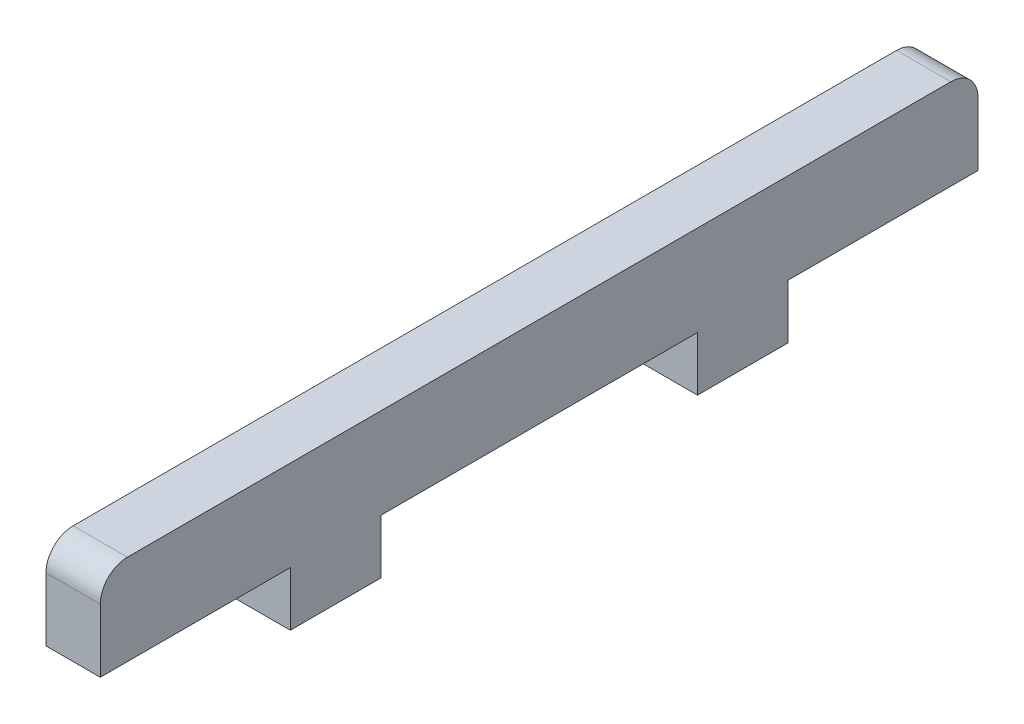
ISO-10303-21;
HEADER;
FILE_DESCRIPTION(('STEP AP214'),'2;1');
FILE_NAME('part.step','',(''),(''),'','','');
FILE_SCHEMA(('AUTOMOTIVE_DESIGN { 1 0 10303 214 1 1 1 1 }'));
ENDSEC;
DATA;
#1=APPLICATION_CONTEXT('core data for automotive mechanical design processes');
#2=APPLICATION_PROTOCOL_DEFINITION('international standard','automotive_design',2000,#1);
#3=PRODUCT_CONTEXT('',#1,'mechanical');
#4=PRODUCT('Part','Part','',(#3));
#5=PRODUCT_RELATED_PRODUCT_CATEGORY('part','',(#4));
#6=PRODUCT_DEFINITION_FORMATION('','',#4);
#7=PRODUCT_DEFINITION_CONTEXT('part definition',#1,'design');
#8=PRODUCT_DEFINITION('design','',#6,#7);
#9=PRODUCT_DEFINITION_SHAPE('','',#8);
#10=(LENGTH_UNIT() NAMED_UNIT(*) SI_UNIT(.MILLI.,.METRE.));
#11=(NAMED_UNIT(*) PLANE_ANGLE_UNIT() SI_UNIT($,.RADIAN.));
#12=(NAMED_UNIT(*) SI_UNIT($,.STERADIAN.) SOLID_ANGLE_UNIT());
#13=UNCERTAINTY_MEASURE_WITH_UNIT(LENGTH_MEASURE(1.E-05),#10,'distance_accuracy_value','');
#14=(GEOMETRIC_REPRESENTATION_CONTEXT(3) GLOBAL_UNCERTAINTY_ASSIGNED_CONTEXT((#13)) GLOBAL_UNIT_ASSIGNED_CONTEXT((#10,
#11,#12)) REPRESENTATION_CONTEXT('',''));
#15=CARTESIAN_POINT('',(0.,0.,0.));
#16=DIRECTION('',(0.,0.,1.));
#17=DIRECTION('',(1.,0.,0.));
#18=AXIS2_PLACEMENT_3D('',#15,#16,#17);
#19=CARTESIAN_POINT('',(6.,243.904678423264,390.651166817679));
#20=DIRECTION('',(0.,0.,-1.));
#21=DIRECTION('',(-1.,0.,0.));
#22=AXIS2_PLACEMENT_3D('',#19,#20,#21);
#23=PLANE('',#22);
#24=DIRECTION('',(0.,-1.,0.));
#25=VECTOR('',#24,1.);
#26=CARTESIAN_POINT('',(6.,243.904678423264,390.651166817679));
#27=LINE('',#26,#25);
#28=CARTESIAN_POINT('',(6.,240.904678423264,390.651166817679));
#29=VERTEX_POINT('',#28);
#30=CARTESIAN_POINT('',(6.,233.904678423264,390.651166817679));
#31=VERTEX_POINT('',#30);
#32=EDGE_CURVE('E133',#29,#31,#27,.T.);
#33=ORIENTED_EDGE('',*,*,#32,.F.);
#34=DIRECTION('',(-1.,0.,0.));
#35=VECTOR('',#34,1.);
#36=CARTESIAN_POINT('',(6.,240.904678423264,390.651166817679));
#37=LINE('',#36,#35);
#38=CARTESIAN_POINT('',(0.,240.904678423264,390.651166817679));
#39=VERTEX_POINT('',#38);
#40=EDGE_CURVE('E11',#29,#39,#37,.T.);
#41=ORIENTED_EDGE('',*,*,#40,.T.);
#42=DIRECTION('',(0.,-1.,0.));
#43=VECTOR('',#42,1.);
#44=CARTESIAN_POINT('',(0.,243.904678423264,390.651166817679));
#45=LINE('',#44,#43);
#46=CARTESIAN_POINT('',(0.,233.904678423264,390.651166817679));
#47=VERTEX_POINT('',#46);
#48=EDGE_CURVE('E153',#39,#47,#45,.T.);
#49=ORIENTED_EDGE('',*,*,#48,.T.);
#50=DIRECTION('',(-1.,0.,0.));
#51=VECTOR('',#50,1.);
#52=CARTESIAN_POINT('',(6.,233.904678423264,390.651166817679));
#53=LINE('',#52,#51);
#54=EDGE_CURVE('E146',#31,#47,#53,.T.);
#55=ORIENTED_EDGE('',*,*,#54,.F.);
#56=EDGE_LOOP('',(#33,#41,#49,#55));
#57=FACE_BOUND('',#56,.T.);
#58=ADVANCED_FACE('F32',(#57),#23,.F.);
#59=CARTESIAN_POINT('',(6.,233.904678423264,390.651166817679));
#60=DIRECTION('',(0.,1.,0.));
#61=DIRECTION('',(0.,0.,1.));
#62=AXIS2_PLACEMENT_3D('',#59,#60,#61);
#63=PLANE('',#62);
#64=DIRECTION('',(0.,0.,-1.));
#65=VECTOR('',#64,1.);
#66=CARTESIAN_POINT('',(0.,233.904678423264,390.651166817679));
#67=LINE('',#66,#65);
#68=CARTESIAN_POINT('',(0.,233.904678423264,369.651166817679));
#69=VERTEX_POINT('',#68);
#70=EDGE_CURVE('E235',#47,#69,#67,.T.);
#71=ORIENTED_EDGE('',*,*,#70,.T.);
#72=DIRECTION('',(-1.,0.,0.));
#73=VECTOR('',#72,1.);
#74=CARTESIAN_POINT('',(6.,233.904678423264,369.651166817679));
#75=LINE('',#74,#73);
#76=CARTESIAN_POINT('',(6.,233.904678423264,369.651166817679));
#77=VERTEX_POINT('',#76);
#78=EDGE_CURVE('E148',#77,#69,#75,.T.);
#79=ORIENTED_EDGE('',*,*,#78,.F.);
#80=DIRECTION('',(0.,0.,-1.));
#81=VECTOR('',#80,1.);
#82=CARTESIAN_POINT('',(6.,233.904678423264,390.651166817679));
#83=LINE('',#82,#81);
#84=EDGE_CURVE('E136',#31,#77,#83,.T.);
#85=ORIENTED_EDGE('',*,*,#84,.F.);
#86=ORIENTED_EDGE('',*,*,#54,.T.);
#87=EDGE_LOOP('',(#71,#79,#85,#86));
#88=FACE_BOUND('',#87,.T.);
#89=ADVANCED_FACE('F145',(#88),#63,.F.);
#90=CARTESIAN_POINT('',(6.,233.904678423264,369.651166817679));
#91=DIRECTION('',(0.,0.,-1.));
#92=DIRECTION('',(-1.,0.,0.));
#93=AXIS2_PLACEMENT_3D('',#90,#91,#92);
#94=PLANE('',#93);
#95=DIRECTION('',(0.,-1.,0.));
#96=VECTOR('',#95,1.);
#97=CARTESIAN_POINT('',(0.,233.904678423264,369.651166817679));
#98=LINE('',#97,#96);
#99=CARTESIAN_POINT('',(0.,227.904678423264,369.651166817679));
#100=VERTEX_POINT('',#99);
#101=EDGE_CURVE('E229',#69,#100,#98,.T.);
#102=ORIENTED_EDGE('',*,*,#101,.T.);
#103=DIRECTION('',(-1.,0.,0.));
#104=VECTOR('',#103,1.);
#105=CARTESIAN_POINT('',(6.,227.904678423264,369.651166817679));
#106=LINE('',#105,#104);
#107=CARTESIAN_POINT('',(6.,227.904678423264,369.651166817679));
#108=VERTEX_POINT('',#107);
#109=EDGE_CURVE('E159',#108,#100,#106,.T.);
#110=ORIENTED_EDGE('',*,*,#109,.F.);
#111=DIRECTION('',(0.,-1.,0.));
#112=VECTOR('',#111,1.);
#113=CARTESIAN_POINT('',(6.,233.904678423264,369.651166817679));
#114=LINE('',#113,#112);
#115=EDGE_CURVE('E150',#77,#108,#114,.T.);
#116=ORIENTED_EDGE('',*,*,#115,.F.);
#117=ORIENTED_EDGE('',*,*,#78,.T.);
#118=EDGE_LOOP('',(#102,#110,#116,#117));
#119=FACE_BOUND('',#118,.T.);
#120=ADVANCED_FACE('F261',(#119),#94,.F.);
#121=CARTESIAN_POINT('',(6.,227.904678423264,369.651166817679));
#122=DIRECTION('',(0.,1.,0.));
#123=DIRECTION('',(0.,0.,1.));
#124=AXIS2_PLACEMENT_3D('',#121,#122,#123);
#125=PLANE('',#124);
#126=DIRECTION('',(0.,0.,-1.));
#127=VECTOR('',#126,1.);
#128=CARTESIAN_POINT('',(0.,227.904678423264,369.651166817679));
#129=LINE('',#128,#127);
#130=CARTESIAN_POINT('',(0.,227.904678423264,359.651166817679));
#131=VERTEX_POINT('',#130);
#132=EDGE_CURVE('E224',#100,#131,#129,.T.);
#133=ORIENTED_EDGE('',*,*,#132,.T.);
#134=DIRECTION('',(-1.,0.,0.));
#135=VECTOR('',#134,1.);
#136=CARTESIAN_POINT('',(6.,227.904678423264,359.651166817679));
#137=LINE('',#136,#135);
#138=CARTESIAN_POINT('',(6.,227.904678423264,359.651166817679));
#139=VERTEX_POINT('',#138);
#140=EDGE_CURVE('E215',#139,#131,#137,.T.);
#141=ORIENTED_EDGE('',*,*,#140,.F.);
#142=DIRECTION('',(0.,0.,-1.));
#143=VECTOR('',#142,1.);
#144=CARTESIAN_POINT('',(6.,227.904678423264,369.651166817679));
#145=LINE('',#144,#143);
#146=EDGE_CURVE('E225',#108,#139,#145,.T.);
#147=ORIENTED_EDGE('',*,*,#146,.F.);
#148=ORIENTED_EDGE('',*,*,#109,.T.);
#149=EDGE_LOOP('',(#133,#141,#147,#148));
#150=FACE_BOUND('',#149,.T.);
#151=ADVANCED_FACE('F222',(#150),#125,.F.);
#152=CARTESIAN_POINT('',(6.,227.904678423264,359.651166817679));
#153=DIRECTION('',(0.,0.,1.));
#154=DIRECTION('',(1.,0.,0.));
#155=AXIS2_PLACEMENT_3D('',#152,#153,#154);
#156=PLANE('',#155);
#157=DIRECTION('',(0.,1.,0.));
#158=VECTOR('',#157,1.);
#159=CARTESIAN_POINT('',(0.,227.904678423264,359.651166817679));
#160=LINE('',#159,#158);
#161=CARTESIAN_POINT('',(0.,233.904678423264,359.651166817679));
#162=VERTEX_POINT('',#161);
#163=EDGE_CURVE('E231',#131,#162,#160,.T.);
#164=ORIENTED_EDGE('',*,*,#163,.T.);
#165=DIRECTION('',(-1.,0.,0.));
#166=VECTOR('',#165,1.);
#167=CARTESIAN_POINT('',(6.,233.904678423264,359.651166817679));
#168=LINE('',#167,#166);
#169=CARTESIAN_POINT('',(6.,233.904678423264,359.651166817679));
#170=VERTEX_POINT('',#169);
#171=EDGE_CURVE('E212',#170,#162,#168,.T.);
#172=ORIENTED_EDGE('',*,*,#171,.F.);
#173=DIRECTION('',(0.,1.,0.));
#174=VECTOR('',#173,1.);
#175=CARTESIAN_POINT('',(6.,227.904678423264,359.651166817679));
#176=LINE('',#175,#174);
#177=EDGE_CURVE('E263',#139,#170,#176,.T.);
#178=ORIENTED_EDGE('',*,*,#177,.F.);
#179=ORIENTED_EDGE('',*,*,#140,.T.);
#180=EDGE_LOOP('',(#164,#172,#178,#179));
#181=FACE_BOUND('',#180,.T.);
#182=ADVANCED_FACE('F285',(#181),#156,.F.);
#183=CARTESIAN_POINT('',(6.,233.904678423264,359.651166817679));
#184=DIRECTION('',(0.,1.,0.));
#185=DIRECTION('',(0.,0.,1.));
#186=AXIS2_PLACEMENT_3D('',#183,#184,#185);
#187=PLANE('',#186);
#188=DIRECTION('',(0.,0.,-1.));
#189=VECTOR('',#188,1.);
#190=CARTESIAN_POINT('',(0.,233.904678423264,359.651166817679));
#191=LINE('',#190,#189);
#192=CARTESIAN_POINT('',(0.,233.904678423264,324.651166817678));
#193=VERTEX_POINT('',#192);
#194=EDGE_CURVE('E233',#162,#193,#191,.T.);
#195=ORIENTED_EDGE('',*,*,#194,.T.);
#196=DIRECTION('',(-1.,0.,0.));
#197=VECTOR('',#196,1.);
#198=CARTESIAN_POINT('',(6.,233.904678423264,324.651166817678));
#199=LINE('',#198,#197);
#200=CARTESIAN_POINT('',(6.,233.904678423264,324.651166817678));
#201=VERTEX_POINT('',#200);
#202=EDGE_CURVE('E209',#201,#193,#199,.T.);
#203=ORIENTED_EDGE('',*,*,#202,.F.);
#204=DIRECTION('',(0.,0.,-1.));
#205=VECTOR('',#204,1.);
#206=CARTESIAN_POINT('',(6.,233.904678423264,359.651166817679));
#207=LINE('',#206,#205);
#208=EDGE_CURVE('E267',#170,#201,#207,.T.);
#209=ORIENTED_EDGE('',*,*,#208,.F.);
#210=ORIENTED_EDGE('',*,*,#171,.T.);
#211=EDGE_LOOP('',(#195,#203,#209,#210));
#212=FACE_BOUND('',#211,.T.);
#213=ADVANCED_FACE('F281',(#212),#187,.F.);
#214=CARTESIAN_POINT('',(6.,233.904678423264,324.651166817678));
#215=DIRECTION('',(0.,0.,-1.));
#216=DIRECTION('',(-1.,0.,0.));
#217=AXIS2_PLACEMENT_3D('',#214,#215,#216);
#218=PLANE('',#217);
#219=DIRECTION('',(0.,-1.,0.));
#220=VECTOR('',#219,1.);
#221=CARTESIAN_POINT('',(0.,233.904678423264,324.651166817678));
#222=LINE('',#221,#220);
#223=CARTESIAN_POINT('',(0.,227.904678423264,324.651166817678));
#224=VERTEX_POINT('',#223);
#225=EDGE_CURVE('E240',#193,#224,#222,.T.);
#226=ORIENTED_EDGE('',*,*,#225,.T.);
#227=DIRECTION('',(-1.,0.,0.));
#228=VECTOR('',#227,1.);
#229=CARTESIAN_POINT('',(6.,227.904678423264,324.651166817678));
#230=LINE('',#229,#228);
#231=CARTESIAN_POINT('',(6.,227.904678423264,324.651166817678));
#232=VERTEX_POINT('',#231);
#233=EDGE_CURVE('E206',#232,#224,#230,.T.);
#234=ORIENTED_EDGE('',*,*,#233,.F.);
#235=DIRECTION('',(0.,-1.,0.));
#236=VECTOR('',#235,1.);
#237=CARTESIAN_POINT('',(6.,233.904678423264,324.651166817678));
#238=LINE('',#237,#236);
#239=EDGE_CURVE('E269',#201,#232,#238,.T.);
#240=ORIENTED_EDGE('',*,*,#239,.F.);
#241=ORIENTED_EDGE('',*,*,#202,.T.);
#242=EDGE_LOOP('',(#226,#234,#240,#241));
#243=FACE_BOUND('',#242,.T.);
#244=ADVANCED_FACE('F277',(#243),#218,.F.);
#245=CARTESIAN_POINT('',(6.,227.904678423264,324.651166817678));
#246=DIRECTION('',(0.,1.,0.));
#247=DIRECTION('',(0.,0.,1.));
#248=AXIS2_PLACEMENT_3D('',#245,#246,#247);
#249=PLANE('',#248);
#250=DIRECTION('',(0.,0.,-1.));
#251=VECTOR('',#250,1.);
#252=CARTESIAN_POINT('',(0.,227.904678423264,324.651166817678));
#253=LINE('',#252,#251);
#254=CARTESIAN_POINT('',(0.,227.904678423264,314.651166817678));
#255=VERTEX_POINT('',#254);
#256=EDGE_CURVE('E242',#224,#255,#253,.T.);
#257=ORIENTED_EDGE('',*,*,#256,.T.);
#258=DIRECTION('',(-1.,0.,0.));
#259=VECTOR('',#258,1.);
#260=CARTESIAN_POINT('',(6.,227.904678423264,314.651166817678));
#261=LINE('',#260,#259);
#262=CARTESIAN_POINT('',(6.,227.904678423264,314.651166817678));
#263=VERTEX_POINT('',#262);
#264=EDGE_CURVE('E203',#263,#255,#261,.T.);
#265=ORIENTED_EDGE('',*,*,#264,.F.);
#266=DIRECTION('',(0.,0.,-1.));
#267=VECTOR('',#266,1.);
#268=CARTESIAN_POINT('',(6.,227.904678423264,324.651166817678));
#269=LINE('',#268,#267);
#270=EDGE_CURVE('E257',#232,#263,#269,.T.);
#271=ORIENTED_EDGE('',*,*,#270,.F.);
#272=ORIENTED_EDGE('',*,*,#233,.T.);
#273=EDGE_LOOP('',(#257,#265,#271,#272));
#274=FACE_BOUND('',#273,.T.);
#275=ADVANCED_FACE('F274',(#274),#249,.F.);
#276=CARTESIAN_POINT('',(6.,227.904678423264,314.651166817678));
#277=DIRECTION('',(0.,0.,1.));
#278=DIRECTION('',(1.,0.,0.));
#279=AXIS2_PLACEMENT_3D('',#276,#277,#278);
#280=PLANE('',#279);
#281=DIRECTION('',(0.,1.,0.));
#282=VECTOR('',#281,1.);
#283=CARTESIAN_POINT('',(0.,227.904678423264,314.651166817678));
#284=LINE('',#283,#282);
#285=CARTESIAN_POINT('',(0.,233.904678423264,314.651166817678));
#286=VERTEX_POINT('',#285);
#287=EDGE_CURVE('E195',#255,#286,#284,.T.);
#288=ORIENTED_EDGE('',*,*,#287,.T.);
#289=DIRECTION('',(-1.,0.,0.));
#290=VECTOR('',#289,1.);
#291=CARTESIAN_POINT('',(6.,233.904678423264,314.651166817678));
#292=LINE('',#291,#290);
#293=CARTESIAN_POINT('',(6.,233.904678423264,314.651166817678));
#294=VERTEX_POINT('',#293);
#295=EDGE_CURVE('E200',#294,#286,#292,.T.);
#296=ORIENTED_EDGE('',*,*,#295,.F.);
#297=DIRECTION('',(0.,1.,0.));
#298=VECTOR('',#297,1.);
#299=CARTESIAN_POINT('',(6.,227.904678423264,314.651166817678));
#300=LINE('',#299,#298);
#301=EDGE_CURVE('E254',#263,#294,#300,.T.);
#302=ORIENTED_EDGE('',*,*,#301,.F.);
#303=ORIENTED_EDGE('',*,*,#264,.T.);
#304=EDGE_LOOP('',(#288,#296,#302,#303));
#305=FACE_BOUND('',#304,.T.);
#306=ADVANCED_FACE('F246',(#305),#280,.F.);
#307=CARTESIAN_POINT('',(6.,233.904678423264,314.651166817678));
#308=DIRECTION('',(0.,1.,0.));
#309=DIRECTION('',(0.,0.,1.));
#310=AXIS2_PLACEMENT_3D('',#307,#308,#309);
#311=PLANE('',#310);
#312=DIRECTION('',(0.,0.,-1.));
#313=VECTOR('',#312,1.);
#314=CARTESIAN_POINT('',(0.,233.904678423264,314.651166817678));
#315=LINE('',#314,#313);
#316=CARTESIAN_POINT('',(0.,233.904678423264,293.651166817678));
#317=VERTEX_POINT('',#316);
#318=EDGE_CURVE('E192',#286,#317,#315,.T.);
#319=ORIENTED_EDGE('',*,*,#318,.T.);
#320=DIRECTION('',(-1.,0.,0.));
#321=VECTOR('',#320,1.);
#322=CARTESIAN_POINT('',(6.,233.904678423264,293.651166817678));
#323=LINE('',#322,#321);
#324=CARTESIAN_POINT('',(6.,233.904678423264,293.651166817678));
#325=VERTEX_POINT('',#324);
#326=EDGE_CURVE('E181',#325,#317,#323,.T.);
#327=ORIENTED_EDGE('',*,*,#326,.F.);
#328=DIRECTION('',(0.,0.,-1.));
#329=VECTOR('',#328,1.);
#330=CARTESIAN_POINT('',(6.,233.904678423264,314.651166817678));
#331=LINE('',#330,#329);
#332=EDGE_CURVE('E253',#294,#325,#331,.T.);
#333=ORIENTED_EDGE('',*,*,#332,.F.);
#334=ORIENTED_EDGE('',*,*,#295,.T.);
#335=EDGE_LOOP('',(#319,#327,#333,#334));
#336=FACE_BOUND('',#335,.T.);
#337=ADVANCED_FACE('F252',(#336),#311,.F.);
#338=CARTESIAN_POINT('',(6.,243.904678423264,293.651166817678));
#339=DIRECTION('',(0.,0.,1.));
#340=DIRECTION('',(1.,0.,0.));
#341=AXIS2_PLACEMENT_3D('',#338,#339,#340);
#342=PLANE('',#341);
#343=DIRECTION('',(0.,1.,0.));
#344=VECTOR('',#343,1.);
#345=CARTESIAN_POINT('',(0.,243.904678423264,293.651166817678));
#346=LINE('',#345,#344);
#347=CARTESIAN_POINT('',(0.,240.904678423264,293.651166817678));
#348=VERTEX_POINT('',#347);
#349=EDGE_CURVE('E188',#317,#348,#346,.T.);
#350=ORIENTED_EDGE('',*,*,#349,.T.);
#351=DIRECTION('',(-1.,0.,0.));
#352=VECTOR('',#351,1.);
#353=CARTESIAN_POINT('',(6.,240.904678423264,293.651166817678));
#354=LINE('',#353,#352);
#355=CARTESIAN_POINT('',(6.,240.904678423264,293.651166817678));
#356=VERTEX_POINT('',#355);
#357=EDGE_CURVE('E55',#348,#356,#354,.F.);
#358=ORIENTED_EDGE('',*,*,#357,.T.);
#359=DIRECTION('',(0.,1.,0.));
#360=VECTOR('',#359,1.);
#361=CARTESIAN_POINT('',(6.,243.904678423264,293.651166817678));
#362=LINE('',#361,#360);
#363=EDGE_CURVE('E173',#325,#356,#362,.T.);
#364=ORIENTED_EDGE('',*,*,#363,.F.);
#365=ORIENTED_EDGE('',*,*,#326,.T.);
#366=EDGE_LOOP('',(#350,#358,#364,#365));
#367=FACE_BOUND('',#366,.T.);
#368=ADVANCED_FACE('F190',(#367),#342,.F.);
#369=CARTESIAN_POINT('',(6.,243.904678423264,390.651166817679));
#370=DIRECTION('',(0.,-1.,0.));
#371=DIRECTION('',(0.,0.,-1.));
#372=AXIS2_PLACEMENT_3D('',#369,#370,#371);
#373=PLANE('',#372);
#374=DIRECTION('',(0.,0.,1.));
#375=VECTOR('',#374,1.);
#376=CARTESIAN_POINT('',(6.,243.904678423264,390.651166817679));
#377=LINE('',#376,#375);
#378=CARTESIAN_POINT('',(6.,243.904678423264,296.651166817678));
#379=VERTEX_POINT('',#378);
#380=CARTESIAN_POINT('',(6.,243.904678423264,387.651166817679));
#381=VERTEX_POINT('',#380);
#382=EDGE_CURVE('E172',#379,#381,#377,.T.);
#383=ORIENTED_EDGE('',*,*,#382,.F.);
#384=DIRECTION('',(-1.,0.,0.));
#385=VECTOR('',#384,1.);
#386=CARTESIAN_POINT('',(6.,243.904678423264,296.651166817678));
#387=LINE('',#386,#385);
#388=CARTESIAN_POINT('',(0.,243.904678423264,296.651166817678));
#389=VERTEX_POINT('',#388);
#390=EDGE_CURVE('E157',#379,#389,#387,.T.);
#391=ORIENTED_EDGE('',*,*,#390,.T.);
#392=DIRECTION('',(0.,0.,1.));
#393=VECTOR('',#392,1.);
#394=CARTESIAN_POINT('',(0.,243.904678423264,390.651166817679));
#395=LINE('',#394,#393);
#396=CARTESIAN_POINT('',(0.,243.904678423264,387.651166817679));
#397=VERTEX_POINT('',#396);
#398=EDGE_CURVE('E141',#389,#397,#395,.T.);
#399=ORIENTED_EDGE('',*,*,#398,.T.);
#400=DIRECTION('',(-1.,0.,0.));
#401=VECTOR('',#400,1.);
#402=CARTESIAN_POINT('',(6.,243.904678423264,387.651166817679));
#403=LINE('',#402,#401);
#404=EDGE_CURVE('E155',#397,#381,#403,.F.);
#405=ORIENTED_EDGE('',*,*,#404,.T.);
#406=EDGE_LOOP('',(#383,#391,#399,#405));
#407=FACE_BOUND('',#406,.T.);
#408=ADVANCED_FACE('F177',(#407),#373,.F.);
#409=CARTESIAN_POINT('',(6.,0.,0.));
#410=DIRECTION('',(1.,0.,0.));
#411=DIRECTION('',(0.,0.,-1.));
#412=AXIS2_PLACEMENT_3D('',#409,#410,#411);
#413=PLANE('',#412);
#414=ORIENTED_EDGE('',*,*,#363,.T.);
#415=CARTESIAN_POINT('',(6.,240.904678423264,296.651166817678));
#416=DIRECTION('',(1.,0.,0.));
#417=DIRECTION('',(0.,0.,-1.));
#418=AXIS2_PLACEMENT_3D('',#415,#416,#417);
#419=CIRCLE('',#418,3.);
#420=EDGE_CURVE('E40',#356,#379,#419,.T.);
#421=ORIENTED_EDGE('',*,*,#420,.T.);
#422=ORIENTED_EDGE('',*,*,#382,.T.);
#423=CARTESIAN_POINT('',(6.,240.904678423264,387.651166817679));
#424=DIRECTION('',(1.,0.,0.));
#425=DIRECTION('',(0.,0.,-1.));
#426=AXIS2_PLACEMENT_3D('',#423,#424,#425);
#427=CIRCLE('',#426,3.);
#428=EDGE_CURVE('E47',#381,#29,#427,.T.);
#429=ORIENTED_EDGE('',*,*,#428,.T.);
#430=ORIENTED_EDGE('',*,*,#32,.T.);
#431=ORIENTED_EDGE('',*,*,#84,.T.);
#432=ORIENTED_EDGE('',*,*,#115,.T.);
#433=ORIENTED_EDGE('',*,*,#146,.T.);
#434=ORIENTED_EDGE('',*,*,#177,.T.);
#435=ORIENTED_EDGE('',*,*,#208,.T.);
#436=ORIENTED_EDGE('',*,*,#239,.T.);
#437=ORIENTED_EDGE('',*,*,#270,.T.);
#438=ORIENTED_EDGE('',*,*,#301,.T.);
#439=ORIENTED_EDGE('',*,*,#332,.T.);
#440=EDGE_LOOP('',(#414,#421,#422,#429,#430,#431,#432,#433,#434,#435,#436,#437,#438,#439));
#441=FACE_BOUND('',#440,.T.);
#442=ADVANCED_FACE('F135',(#441),#413,.T.);
#443=CARTESIAN_POINT('',(0.,0.,0.));
#444=DIRECTION('',(1.,0.,0.));
#445=DIRECTION('',(0.,0.,-1.));
#446=AXIS2_PLACEMENT_3D('',#443,#444,#445);
#447=PLANE('',#446);
#448=ORIENTED_EDGE('',*,*,#398,.F.);
#449=CARTESIAN_POINT('',(0.,240.904678423264,296.651166817678));
#450=DIRECTION('',(1.,0.,0.));
#451=DIRECTION('',(0.,0.,-1.));
#452=AXIS2_PLACEMENT_3D('',#449,#450,#451);
#453=CIRCLE('',#452,3.);
#454=EDGE_CURVE('E167',#389,#348,#453,.F.);
#455=ORIENTED_EDGE('',*,*,#454,.T.);
#456=ORIENTED_EDGE('',*,*,#349,.F.);
#457=ORIENTED_EDGE('',*,*,#318,.F.);
#458=ORIENTED_EDGE('',*,*,#287,.F.);
#459=ORIENTED_EDGE('',*,*,#256,.F.);
#460=ORIENTED_EDGE('',*,*,#225,.F.);
#461=ORIENTED_EDGE('',*,*,#194,.F.);
#462=ORIENTED_EDGE('',*,*,#163,.F.);
#463=ORIENTED_EDGE('',*,*,#132,.F.);
#464=ORIENTED_EDGE('',*,*,#101,.F.);
#465=ORIENTED_EDGE('',*,*,#70,.F.);
#466=ORIENTED_EDGE('',*,*,#48,.F.);
#467=CARTESIAN_POINT('',(0.,240.904678423264,387.651166817679));
#468=DIRECTION('',(1.,0.,0.));
#469=DIRECTION('',(0.,0.,-1.));
#470=AXIS2_PLACEMENT_3D('',#467,#468,#469);
#471=CIRCLE('',#470,3.);
#472=EDGE_CURVE('E165',#39,#397,#471,.F.);
#473=ORIENTED_EDGE('',*,*,#472,.T.);
#474=EDGE_LOOP('',(#448,#455,#456,#457,#458,#459,#460,#461,#462,#463,#464,#465,#466,#473));
#475=FACE_BOUND('',#474,.T.);
#476=ADVANCED_FACE('F186',(#475),#447,.F.);
#477=CARTESIAN_POINT('',(6.,240.904678423264,296.651166817678));
#478=DIRECTION('',(-1.,0.,0.));
#479=DIRECTION('',(0.,0.,1.));
#480=AXIS2_PLACEMENT_3D('',#477,#478,#479);
#481=CYLINDRICAL_SURFACE('',#480,3.);
#482=ORIENTED_EDGE('',*,*,#420,.F.);
#483=ORIENTED_EDGE('',*,*,#357,.F.);
#484=ORIENTED_EDGE('',*,*,#454,.F.);
#485=ORIENTED_EDGE('',*,*,#390,.F.);
#486=EDGE_LOOP('',(#482,#483,#484,#485));
#487=FACE_BOUND('',#486,.T.);
#488=ADVANCED_FACE('F183',(#487),#481,.T.);
#489=CARTESIAN_POINT('',(6.,240.904678423264,387.651166817679));
#490=DIRECTION('',(-1.,0.,0.));
#491=DIRECTION('',(0.,0.,1.));
#492=AXIS2_PLACEMENT_3D('',#489,#490,#491);
#493=CYLINDRICAL_SURFACE('',#492,3.);
#494=ORIENTED_EDGE('',*,*,#428,.F.);
#495=ORIENTED_EDGE('',*,*,#404,.F.);
#496=ORIENTED_EDGE('',*,*,#472,.F.);
#497=ORIENTED_EDGE('',*,*,#40,.F.);
#498=EDGE_LOOP('',(#494,#495,#496,#497));
#499=FACE_BOUND('',#498,.T.);
#500=ADVANCED_FACE('F34',(#499),#493,.T.);
#501=CLOSED_SHELL('',(#58,#89,#120,#151,#182,#213,#244,#275,#306,#337,#368,#408,#442,#476,#488,#500));
#502=MANIFOLD_SOLID_BREP('B2',#501);
#503=ADVANCED_BREP_SHAPE_REPRESENTATION('',(#18,#502),#14);
#504=SHAPE_DEFINITION_REPRESENTATION(#9,#503);
ENDSEC;
END-ISO-10303-21;
